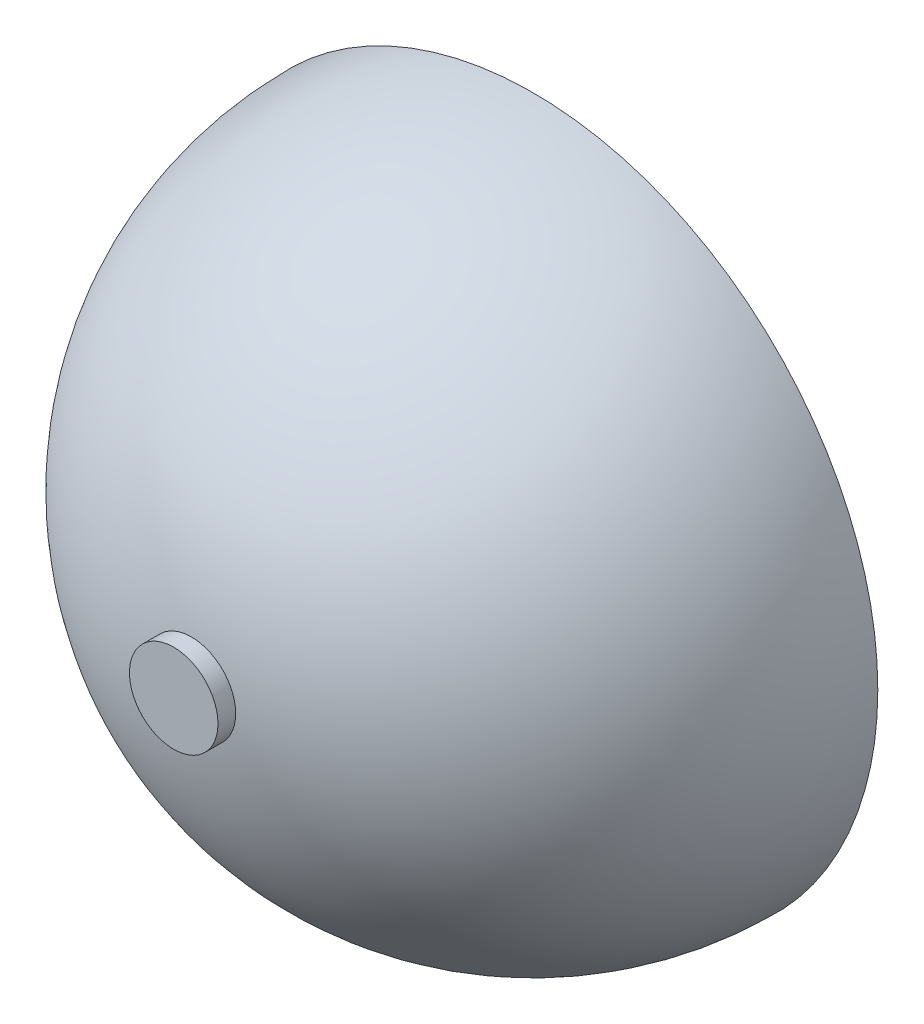
ISO-10303-21;
HEADER;
FILE_DESCRIPTION(('STEP AP214'),'2;1');
FILE_NAME('part.step','',(''),(''),'','','');
FILE_SCHEMA(('AUTOMOTIVE_DESIGN { 1 0 10303 214 1 1 1 1 }'));
ENDSEC;
DATA;
#1=APPLICATION_CONTEXT('core data for automotive mechanical design processes');
#2=APPLICATION_PROTOCOL_DEFINITION('international standard','automotive_design',2000,#1);
#3=PRODUCT_CONTEXT('',#1,'mechanical');
#4=PRODUCT('Part','Part','',(#3));
#5=PRODUCT_RELATED_PRODUCT_CATEGORY('part','',(#4));
#6=PRODUCT_DEFINITION_FORMATION('','',#4);
#7=PRODUCT_DEFINITION_CONTEXT('part definition',#1,'design');
#8=PRODUCT_DEFINITION('design','',#6,#7);
#9=PRODUCT_DEFINITION_SHAPE('','',#8);
#10=(LENGTH_UNIT() NAMED_UNIT(*) SI_UNIT(.MILLI.,.METRE.));
#11=(NAMED_UNIT(*) PLANE_ANGLE_UNIT() SI_UNIT($,.RADIAN.));
#12=(NAMED_UNIT(*) SI_UNIT($,.STERADIAN.) SOLID_ANGLE_UNIT());
#13=UNCERTAINTY_MEASURE_WITH_UNIT(LENGTH_MEASURE(1.E-05),#10,'distance_accuracy_value','');
#14=(GEOMETRIC_REPRESENTATION_CONTEXT(3) GLOBAL_UNCERTAINTY_ASSIGNED_CONTEXT((#13)) GLOBAL_UNIT_ASSIGNED_CONTEXT((#10,
#11,#12)) REPRESENTATION_CONTEXT('',''));
#15=CARTESIAN_POINT('',(0.,0.,0.));
#16=DIRECTION('',(0.,0.,1.));
#17=DIRECTION('',(1.,0.,0.));
#18=AXIS2_PLACEMENT_3D('',#15,#16,#17);
#19=CARTESIAN_POINT('',(0.,0.,0.));
#20=DIRECTION('',(0.,0.,1.));
#21=DIRECTION('',(-1.,0.,0.));
#22=AXIS2_PLACEMENT_3D('',#19,#20,#21);
#23=SPHERICAL_SURFACE('',#22,17.4706033628876);
#24=CARTESIAN_POINT('',(0.,0.,2.));
#25=DIRECTION('',(0.,0.,1.));
#26=DIRECTION('',(1.,0.,0.));
#27=AXIS2_PLACEMENT_3D('',#24,#25,#26);
#28=CIRCLE('',#27,17.3557478047862);
#29=CARTESIAN_POINT('',(17.3557478047862,0.,2.));
#30=VERTEX_POINT('',#29);
#31=EDGE_CURVE('E10',#30,#30,#28,.T.);
#32=ORIENTED_EDGE('',*,*,#31,.F.);
#33=EDGE_LOOP('',(#32));
#34=FACE_BOUND('',#33,.T.);
#35=ADVANCED_FACE('F28',(#34),#23,.F.);
#36=CARTESIAN_POINT('',(0.,0.,14.8031747125498));
#37=DIRECTION('',(0.,0.,1.));
#38=DIRECTION('',(1.,0.,0.));
#39=AXIS2_PLACEMENT_3D('',#36,#37,#38);
#40=CYLINDRICAL_SURFACE('',#39,17.3557478047862);
#41=CARTESIAN_POINT('',(0.,0.,0.));
#42=DIRECTION('',(0.,0.,1.));
#43=DIRECTION('',(1.,0.,0.));
#44=AXIS2_PLACEMENT_3D('',#41,#42,#43);
#45=CIRCLE('',#44,17.3557478047862);
#46=CARTESIAN_POINT('',(17.3557478047862,0.,0.));
#47=VERTEX_POINT('',#46);
#48=EDGE_CURVE('E34',#47,#47,#45,.T.);
#49=ORIENTED_EDGE('',*,*,#48,.F.);
#50=EDGE_LOOP('',(#49));
#51=FACE_BOUND('',#50,.T.);
#52=ORIENTED_EDGE('',*,*,#31,.T.);
#53=EDGE_LOOP('',(#52));
#54=FACE_BOUND('',#53,.T.);
#55=ADVANCED_FACE('F67',(#51,#54),#40,.F.);
#56=CARTESIAN_POINT('',(-32.2023848135839,0.,0.));
#57=DIRECTION('',(0.,0.,-1.));
#58=DIRECTION('',(-1.,0.,0.));
#59=AXIS2_PLACEMENT_3D('',#56,#57,#58);
#60=PLANE('',#59);
#61=ORIENTED_EDGE('',*,*,#48,.T.);
#62=EDGE_LOOP('',(#61));
#63=FACE_BOUND('',#62,.T.);
#64=CARTESIAN_POINT('',(0.,0.,0.));
#65=DIRECTION('',(0.,0.,1.));
#66=DIRECTION('',(1.,0.,0.));
#67=AXIS2_PLACEMENT_3D('',#64,#65,#66);
#68=CIRCLE('',#67,19.4706033628876);
#69=CARTESIAN_POINT('',(19.4706033628876,0.,0.));
#70=VERTEX_POINT('',#69);
#71=EDGE_CURVE('E38',#70,#70,#68,.T.);
#72=ORIENTED_EDGE('',*,*,#71,.F.);
#73=EDGE_LOOP('',(#72));
#74=FACE_BOUND('',#73,.T.);
#75=ADVANCED_FACE('F62',(#63,#74),#60,.T.);
#76=CARTESIAN_POINT('',(0.,0.,0.));
#77=DIRECTION('',(0.,0.,1.));
#78=DIRECTION('',(-1.,0.,0.));
#79=AXIS2_PLACEMENT_3D('',#76,#77,#78);
#80=SPHERICAL_SURFACE('',#79,19.4706033628876);
#81=CARTESIAN_POINT('',(0.,0.,19.3094379854746));
#82=DIRECTION('',(0.,0.,1.));
#83=DIRECTION('',(1.,0.,0.));
#84=AXIS2_PLACEMENT_3D('',#81,#82,#83);
#85=CIRCLE('',#84,2.5);
#86=CARTESIAN_POINT('',(2.5,0.,19.3094379854746));
#87=VERTEX_POINT('',#86);
#88=EDGE_CURVE('E42',#87,#87,#85,.T.);
#89=ORIENTED_EDGE('',*,*,#88,.F.);
#90=EDGE_LOOP('',(#89));
#91=FACE_BOUND('',#90,.T.);
#92=ORIENTED_EDGE('',*,*,#71,.T.);
#93=EDGE_LOOP('',(#92));
#94=FACE_BOUND('',#93,.T.);
#95=ADVANCED_FACE('F56',(#91,#94),#80,.T.);
#96=CARTESIAN_POINT('',(0.,0.,14.8031747125498));
#97=DIRECTION('',(0.,0.,1.));
#98=DIRECTION('',(1.,0.,0.));
#99=AXIS2_PLACEMENT_3D('',#96,#97,#98);
#100=CYLINDRICAL_SURFACE('',#99,2.5);
#101=CARTESIAN_POINT('',(0.,0.,20.3094379854746));
#102=DIRECTION('',(0.,0.,1.));
#103=DIRECTION('',(1.,0.,0.));
#104=AXIS2_PLACEMENT_3D('',#101,#102,#103);
#105=CIRCLE('',#104,2.5);
#106=CARTESIAN_POINT('',(2.5,0.,20.3094379854746));
#107=VERTEX_POINT('',#106);
#108=EDGE_CURVE('E47',#107,#107,#105,.T.);
#109=ORIENTED_EDGE('',*,*,#108,.F.);
#110=EDGE_LOOP('',(#109));
#111=FACE_BOUND('',#110,.T.);
#112=ORIENTED_EDGE('',*,*,#88,.T.);
#113=EDGE_LOOP('',(#112));
#114=FACE_BOUND('',#113,.T.);
#115=ADVANCED_FACE('F53',(#111,#114),#100,.T.);
#116=CARTESIAN_POINT('',(-32.2023848135839,0.,20.3094379854746));
#117=DIRECTION('',(0.,0.,1.));
#118=DIRECTION('',(1.,0.,0.));
#119=AXIS2_PLACEMENT_3D('',#116,#117,#118);
#120=PLANE('',#119);
#121=ORIENTED_EDGE('',*,*,#108,.T.);
#122=EDGE_LOOP('',(#121));
#123=FACE_BOUND('',#122,.T.);
#124=ADVANCED_FACE('F51',(#123),#120,.T.);
#125=CLOSED_SHELL('',(#35,#55,#75,#95,#115,#124));
#126=MANIFOLD_SOLID_BREP('B2',#125);
#127=ADVANCED_BREP_SHAPE_REPRESENTATION('',(#18,#126),#14);
#128=SHAPE_DEFINITION_REPRESENTATION(#9,#127);
ENDSEC;
END-ISO-10303-21;
